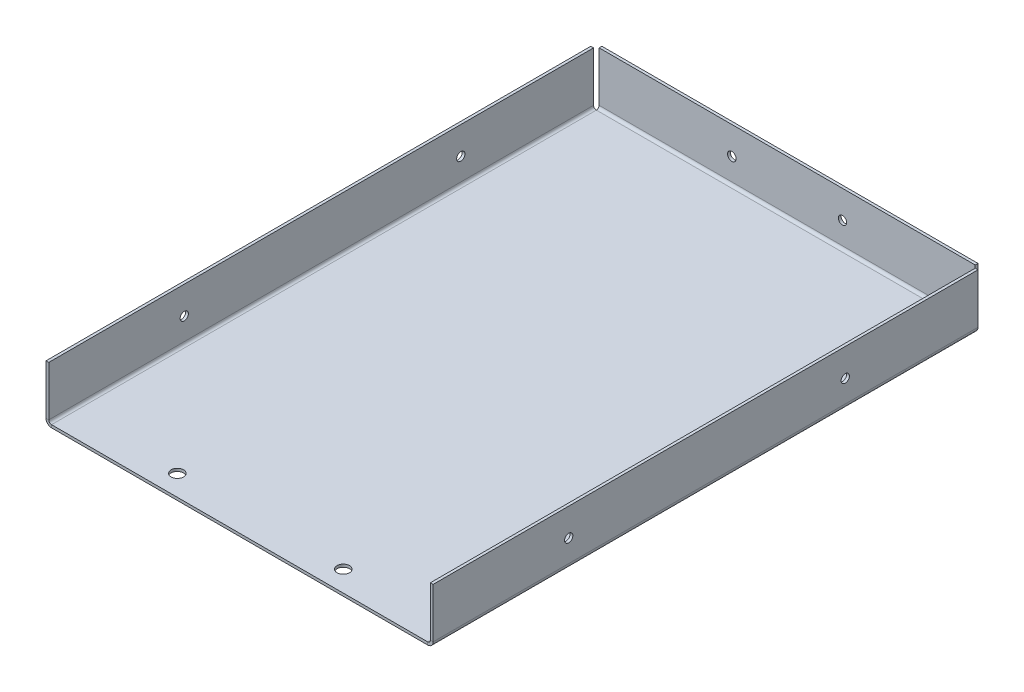
ISO-10303-21;
HEADER;
FILE_DESCRIPTION(('STEP AP214'),'2;1');
FILE_NAME('part.step','',(''),(''),'','','');
FILE_SCHEMA(('AUTOMOTIVE_DESIGN { 1 0 10303 214 1 1 1 1 }'));
ENDSEC;
DATA;
#1=APPLICATION_CONTEXT('core data for automotive mechanical design processes');
#2=APPLICATION_PROTOCOL_DEFINITION('international standard','automotive_design',2000,#1);
#3=PRODUCT_CONTEXT('',#1,'mechanical');
#4=PRODUCT('Part','Part','',(#3));
#5=PRODUCT_RELATED_PRODUCT_CATEGORY('part','',(#4));
#6=PRODUCT_DEFINITION_FORMATION('','',#4);
#7=PRODUCT_DEFINITION_CONTEXT('part definition',#1,'design');
#8=PRODUCT_DEFINITION('design','',#6,#7);
#9=PRODUCT_DEFINITION_SHAPE('','',#8);
#10=(LENGTH_UNIT() NAMED_UNIT(*) SI_UNIT(.MILLI.,.METRE.));
#11=(NAMED_UNIT(*) PLANE_ANGLE_UNIT() SI_UNIT($,.RADIAN.));
#12=(NAMED_UNIT(*) SI_UNIT($,.STERADIAN.) SOLID_ANGLE_UNIT());
#13=UNCERTAINTY_MEASURE_WITH_UNIT(LENGTH_MEASURE(1.E-05),#10,'distance_accuracy_value','');
#14=(GEOMETRIC_REPRESENTATION_CONTEXT(3) GLOBAL_UNCERTAINTY_ASSIGNED_CONTEXT((#13)) GLOBAL_UNIT_ASSIGNED_CONTEXT((#10,
#11,#12)) REPRESENTATION_CONTEXT('',''));
#15=CARTESIAN_POINT('',(0.,0.,0.));
#16=DIRECTION('',(0.,0.,1.));
#17=DIRECTION('',(1.,0.,0.));
#18=AXIS2_PLACEMENT_3D('',#15,#16,#17);
#19=CARTESIAN_POINT('',(0.,-1.,0.));
#20=DIRECTION('',(0.,-1.,0.));
#21=DIRECTION('',(0.,0.,-1.));
#22=AXIS2_PLACEMENT_3D('',#19,#20,#21);
#23=PLANE('',#22);
#24=CARTESIAN_POINT('',(38.0000000000019,-1.,-7.49999999999906));
#25=DIRECTION('',(0.,-1.,0.));
#26=DIRECTION('',(0.,0.,-1.));
#27=AXIS2_PLACEMENT_3D('',#24,#25,#26);
#28=CIRCLE('',#27,2.24999999999995);
#29=CARTESIAN_POINT('',(38.0000000000019,-1.,-9.74999999999902));
#30=VERTEX_POINT('',#29);
#31=EDGE_CURVE('E227',#30,#30,#28,.T.);
#32=ORIENTED_EDGE('',*,*,#31,.F.);
#33=EDGE_LOOP('',(#32));
#34=FACE_BOUND('',#33,.T.);
#35=CARTESIAN_POINT('',(98.0000000000019,-1.,-7.49999999999901));
#36=DIRECTION('',(0.,-1.,0.));
#37=DIRECTION('',(0.,0.,-1.));
#38=AXIS2_PLACEMENT_3D('',#35,#36,#37);
#39=CIRCLE('',#38,2.24999999999996);
#40=CARTESIAN_POINT('',(98.0000000000019,-1.,-9.74999999999896));
#41=VERTEX_POINT('',#40);
#42=EDGE_CURVE('E236',#41,#41,#39,.T.);
#43=ORIENTED_EDGE('',*,*,#42,.F.);
#44=EDGE_LOOP('',(#43));
#45=FACE_BOUND('',#44,.T.);
#46=DIRECTION('',(0.,0.,1.));
#47=VECTOR('',#46,1.);
#48=CARTESIAN_POINT('',(0.,-1.,0.));
#49=LINE('',#48,#47);
#50=CARTESIAN_POINT('',(0.,-1.00000000000001,-197.));
#51=VERTEX_POINT('',#50);
#52=CARTESIAN_POINT('',(0.,-1.,0.));
#53=VERTEX_POINT('',#52);
#54=EDGE_CURVE('E200',#51,#53,#49,.T.);
#55=ORIENTED_EDGE('',*,*,#54,.F.);
#56=DIRECTION('',(-1.,0.,0.));
#57=VECTOR('',#56,1.);
#58=CARTESIAN_POINT('',(0.,-1.00000000000001,-197.));
#59=LINE('',#58,#57);
#60=CARTESIAN_POINT('',(136.,-0.999999999999997,-197.));
#61=VERTEX_POINT('',#60);
#62=EDGE_CURVE('E114',#51,#61,#59,.F.);
#63=ORIENTED_EDGE('',*,*,#62,.T.);
#64=DIRECTION('',(0.,0.,-1.));
#65=VECTOR('',#64,1.);
#66=CARTESIAN_POINT('',(136.,-1.,0.));
#67=LINE('',#66,#65);
#68=CARTESIAN_POINT('',(136.,-1.,0.));
#69=VERTEX_POINT('',#68);
#70=EDGE_CURVE('E94',#69,#61,#67,.T.);
#71=ORIENTED_EDGE('',*,*,#70,.F.);
#72=DIRECTION('',(1.,0.,0.));
#73=VECTOR('',#72,1.);
#74=CARTESIAN_POINT('',(0.,-1.,0.));
#75=LINE('',#74,#73);
#76=EDGE_CURVE('E203',#53,#69,#75,.T.);
#77=ORIENTED_EDGE('',*,*,#76,.F.);
#78=EDGE_LOOP('',(#55,#63,#71,#77));
#79=FACE_BOUND('',#78,.T.);
#80=ADVANCED_FACE('F76',(#34,#45,#79),#23,.T.);
#81=CARTESIAN_POINT('',(0.,0.,0.));
#82=DIRECTION('',(0.,-1.,0.));
#83=DIRECTION('',(0.,0.,-1.));
#84=AXIS2_PLACEMENT_3D('',#81,#82,#83);
#85=PLANE('',#84);
#86=CARTESIAN_POINT('',(38.0000000000019,0.,-7.49999999999906));
#87=DIRECTION('',(0.,-1.,0.));
#88=DIRECTION('',(0.,0.,-1.));
#89=AXIS2_PLACEMENT_3D('',#86,#87,#88);
#90=CIRCLE('',#89,2.24999999999995);
#91=CARTESIAN_POINT('',(38.0000000000019,0.,-9.74999999999902));
#92=VERTEX_POINT('',#91);
#93=EDGE_CURVE('E218',#92,#92,#90,.T.);
#94=ORIENTED_EDGE('',*,*,#93,.T.);
#95=EDGE_LOOP('',(#94));
#96=FACE_BOUND('',#95,.T.);
#97=CARTESIAN_POINT('',(98.0000000000019,0.,-7.49999999999901));
#98=DIRECTION('',(0.,-1.,0.));
#99=DIRECTION('',(0.,0.,-1.));
#100=AXIS2_PLACEMENT_3D('',#97,#98,#99);
#101=CIRCLE('',#100,2.24999999999996);
#102=CARTESIAN_POINT('',(98.0000000000019,0.,-9.74999999999896));
#103=VERTEX_POINT('',#102);
#104=EDGE_CURVE('E224',#103,#103,#101,.T.);
#105=ORIENTED_EDGE('',*,*,#104,.T.);
#106=EDGE_LOOP('',(#105));
#107=FACE_BOUND('',#106,.T.);
#108=DIRECTION('',(-1.,0.,0.));
#109=VECTOR('',#108,1.);
#110=CARTESIAN_POINT('',(0.,0.,-197.));
#111=LINE('',#110,#109);
#112=CARTESIAN_POINT('',(0.,0.,-197.));
#113=VERTEX_POINT('',#112);
#114=CARTESIAN_POINT('',(136.,0.,-197.));
#115=VERTEX_POINT('',#114);
#116=EDGE_CURVE('E191',#113,#115,#111,.F.);
#117=ORIENTED_EDGE('',*,*,#116,.F.);
#118=DIRECTION('',(0.,0.,1.));
#119=VECTOR('',#118,1.);
#120=CARTESIAN_POINT('',(0.,0.,0.));
#121=LINE('',#120,#119);
#122=CARTESIAN_POINT('',(0.,0.,0.));
#123=VERTEX_POINT('',#122);
#124=EDGE_CURVE('E106',#113,#123,#121,.T.);
#125=ORIENTED_EDGE('',*,*,#124,.T.);
#126=DIRECTION('',(1.,0.,0.));
#127=VECTOR('',#126,1.);
#128=CARTESIAN_POINT('',(0.,0.,0.));
#129=LINE('',#128,#127);
#130=CARTESIAN_POINT('',(136.,0.,0.));
#131=VERTEX_POINT('',#130);
#132=EDGE_CURVE('E208',#123,#131,#129,.T.);
#133=ORIENTED_EDGE('',*,*,#132,.T.);
#134=DIRECTION('',(0.,0.,-1.));
#135=VECTOR('',#134,1.);
#136=CARTESIAN_POINT('',(136.,0.,0.));
#137=LINE('',#136,#135);
#138=EDGE_CURVE('E204',#131,#115,#137,.T.);
#139=ORIENTED_EDGE('',*,*,#138,.T.);
#140=EDGE_LOOP('',(#117,#125,#133,#139));
#141=FACE_BOUND('',#140,.T.);
#142=ADVANCED_FACE('F436',(#96,#107,#141),#85,.F.);
#143=CARTESIAN_POINT('',(0.,-1.,0.));
#144=DIRECTION('',(0.,0.,1.));
#145=DIRECTION('',(1.,0.,0.));
#146=AXIS2_PLACEMENT_3D('',#143,#144,#145);
#147=PLANE('',#146);
#148=ORIENTED_EDGE('',*,*,#132,.F.);
#149=DIRECTION('',(0.,1.,0.));
#150=VECTOR('',#149,1.);
#151=CARTESIAN_POINT('',(0.,-1.,0.));
#152=LINE('',#151,#150);
#153=EDGE_CURVE('E86',#53,#123,#152,.T.);
#154=ORIENTED_EDGE('',*,*,#153,.F.);
#155=ORIENTED_EDGE('',*,*,#76,.T.);
#156=DIRECTION('',(0.,1.,0.));
#157=VECTOR('',#156,1.);
#158=CARTESIAN_POINT('',(136.,-1.,0.));
#159=LINE('',#158,#157);
#160=EDGE_CURVE('E13',#69,#131,#159,.T.);
#161=ORIENTED_EDGE('',*,*,#160,.T.);
#162=EDGE_LOOP('',(#148,#154,#155,#161));
#163=FACE_BOUND('',#162,.T.);
#164=ADVANCED_FACE('F78',(#163),#147,.T.);
#165=CARTESIAN_POINT('',(136.,0.999999999999994,-197.));
#166=DIRECTION('',(1.,0.,0.));
#167=DIRECTION('',(0.,0.,-1.));
#168=AXIS2_PLACEMENT_3D('',#165,#166,#167);
#169=PLANE('',#168);
#170=DIRECTION('',(0.,0.,-1.));
#171=VECTOR('',#170,1.);
#172=CARTESIAN_POINT('',(136.,1.,-198.));
#173=LINE('',#172,#171);
#174=CARTESIAN_POINT('',(136.,0.999999999999991,-198.));
#175=VERTEX_POINT('',#174);
#176=CARTESIAN_POINT('',(136.,0.999999999999988,-199.));
#177=VERTEX_POINT('',#176);
#178=EDGE_CURVE('E132',#175,#177,#173,.T.);
#179=ORIENTED_EDGE('',*,*,#178,.F.);
#180=CARTESIAN_POINT('',(136.,0.999999999999994,-197.));
#181=DIRECTION('',(-1.,0.,0.));
#182=DIRECTION('',(0.,0.,1.));
#183=AXIS2_PLACEMENT_3D('',#180,#181,#182);
#184=CIRCLE('',#183,1.);
#185=EDGE_CURVE('E189',#115,#175,#184,.F.);
#186=ORIENTED_EDGE('',*,*,#185,.F.);
#187=DIRECTION('',(0.,-1.,0.));
#188=VECTOR('',#187,1.);
#189=CARTESIAN_POINT('',(136.,0.,-197.));
#190=LINE('',#189,#188);
#191=EDGE_CURVE('E195',#115,#61,#190,.T.);
#192=ORIENTED_EDGE('',*,*,#191,.T.);
#193=CARTESIAN_POINT('',(136.,0.999999999999994,-197.));
#194=DIRECTION('',(-1.,0.,0.));
#195=DIRECTION('',(0.,0.,1.));
#196=AXIS2_PLACEMENT_3D('',#193,#194,#195);
#197=CIRCLE('',#196,2.);
#198=EDGE_CURVE('E184',#61,#177,#197,.F.);
#199=ORIENTED_EDGE('',*,*,#198,.T.);
#200=EDGE_LOOP('',(#179,#186,#192,#199));
#201=FACE_BOUND('',#200,.T.);
#202=ADVANCED_FACE('F379',(#201),#169,.T.);
#203=CARTESIAN_POINT('',(0.,0.999999999999994,-197.));
#204=DIRECTION('',(1.,0.,0.));
#205=DIRECTION('',(0.,0.,-1.));
#206=AXIS2_PLACEMENT_3D('',#203,#204,#205);
#207=PLANE('',#206);
#208=CARTESIAN_POINT('',(0.,0.999999999999994,-197.));
#209=DIRECTION('',(-1.,0.,0.));
#210=DIRECTION('',(0.,0.,1.));
#211=AXIS2_PLACEMENT_3D('',#208,#209,#210);
#212=CIRCLE('',#211,1.);
#213=CARTESIAN_POINT('',(0.,0.999999999999991,-198.));
#214=VERTEX_POINT('',#213);
#215=EDGE_CURVE('E182',#214,#113,#212,.T.);
#216=ORIENTED_EDGE('',*,*,#215,.F.);
#217=DIRECTION('',(0.,0.,-1.));
#218=VECTOR('',#217,1.);
#219=CARTESIAN_POINT('',(0.,1.,-198.));
#220=LINE('',#219,#218);
#221=CARTESIAN_POINT('',(0.,1.00000000000001,-199.));
#222=VERTEX_POINT('',#221);
#223=EDGE_CURVE('E360',#214,#222,#220,.T.);
#224=ORIENTED_EDGE('',*,*,#223,.T.);
#225=CARTESIAN_POINT('',(0.,0.999999999999994,-197.));
#226=DIRECTION('',(-1.,0.,0.));
#227=DIRECTION('',(0.,0.,1.));
#228=AXIS2_PLACEMENT_3D('',#225,#226,#227);
#229=CIRCLE('',#228,2.);
#230=EDGE_CURVE('E185',#222,#51,#229,.T.);
#231=ORIENTED_EDGE('',*,*,#230,.T.);
#232=DIRECTION('',(0.,-1.,0.));
#233=VECTOR('',#232,1.);
#234=CARTESIAN_POINT('',(0.,0.,-197.));
#235=LINE('',#234,#233);
#236=EDGE_CURVE('E187',#113,#51,#235,.T.);
#237=ORIENTED_EDGE('',*,*,#236,.F.);
#238=EDGE_LOOP('',(#216,#224,#231,#237));
#239=FACE_BOUND('',#238,.T.);
#240=ADVANCED_FACE('F374',(#239),#207,.F.);
#241=CARTESIAN_POINT('',(0.,0.999999999999994,-197.));
#242=DIRECTION('',(-1.,0.,0.));
#243=DIRECTION('',(0.,0.,-1.));
#244=AXIS2_PLACEMENT_3D('',#241,#242,#243);
#245=CYLINDRICAL_SURFACE('',#244,2.);
#246=ORIENTED_EDGE('',*,*,#62,.F.);
#247=ORIENTED_EDGE('',*,*,#230,.F.);
#248=DIRECTION('',(1.,0.,0.));
#249=VECTOR('',#248,1.);
#250=CARTESIAN_POINT('',(0.,1.00000000000001,-199.));
#251=LINE('',#250,#249);
#252=EDGE_CURVE('E363',#222,#177,#251,.T.);
#253=ORIENTED_EDGE('',*,*,#252,.T.);
#254=ORIENTED_EDGE('',*,*,#198,.F.);
#255=EDGE_LOOP('',(#246,#247,#253,#254));
#256=FACE_BOUND('',#255,.T.);
#257=ADVANCED_FACE('F378',(#256),#245,.T.);
#258=CARTESIAN_POINT('',(0.,0.999999999999994,-197.));
#259=DIRECTION('',(-1.,0.,0.));
#260=DIRECTION('',(0.,0.,-1.));
#261=AXIS2_PLACEMENT_3D('',#258,#259,#260);
#262=CYLINDRICAL_SURFACE('',#261,1.);
#263=ORIENTED_EDGE('',*,*,#116,.T.);
#264=ORIENTED_EDGE('',*,*,#185,.T.);
#265=DIRECTION('',(-1.,0.,0.));
#266=VECTOR('',#265,1.);
#267=CARTESIAN_POINT('',(136.,1.,-198.));
#268=LINE('',#267,#266);
#269=EDGE_CURVE('E175',#175,#214,#268,.T.);
#270=ORIENTED_EDGE('',*,*,#269,.T.);
#271=ORIENTED_EDGE('',*,*,#215,.T.);
#272=EDGE_LOOP('',(#263,#264,#270,#271));
#273=FACE_BOUND('',#272,.T.);
#274=ADVANCED_FACE('F508',(#273),#262,.F.);
#275=CARTESIAN_POINT('',(0.,19.,-199.));
#276=DIRECTION('',(1.,0.,0.));
#277=DIRECTION('',(0.,0.,-1.));
#278=AXIS2_PLACEMENT_3D('',#275,#276,#277);
#279=PLANE('',#278);
#280=ORIENTED_EDGE('',*,*,#223,.F.);
#281=DIRECTION('',(0.,1.,0.));
#282=VECTOR('',#281,1.);
#283=CARTESIAN_POINT('',(0.,19.,-198.));
#284=LINE('',#283,#282);
#285=CARTESIAN_POINT('',(0.,19.,-198.));
#286=VERTEX_POINT('',#285);
#287=EDGE_CURVE('E166',#214,#286,#284,.T.);
#288=ORIENTED_EDGE('',*,*,#287,.T.);
#289=DIRECTION('',(0.,0.,1.));
#290=VECTOR('',#289,1.);
#291=CARTESIAN_POINT('',(0.,19.,-199.));
#292=LINE('',#291,#290);
#293=CARTESIAN_POINT('',(0.,19.,-199.));
#294=VERTEX_POINT('',#293);
#295=EDGE_CURVE('E161',#294,#286,#292,.T.);
#296=ORIENTED_EDGE('',*,*,#295,.F.);
#297=DIRECTION('',(0.,1.,0.));
#298=VECTOR('',#297,1.);
#299=CARTESIAN_POINT('',(0.,19.,-199.));
#300=LINE('',#299,#298);
#301=EDGE_CURVE('E176',#222,#294,#300,.T.);
#302=ORIENTED_EDGE('',*,*,#301,.F.);
#303=EDGE_LOOP('',(#280,#288,#296,#302));
#304=FACE_BOUND('',#303,.T.);
#305=ADVANCED_FACE('F369',(#304),#279,.F.);
#306=CARTESIAN_POINT('',(136.,0.,-199.));
#307=DIRECTION('',(-1.,0.,0.));
#308=DIRECTION('',(0.,0.,1.));
#309=AXIS2_PLACEMENT_3D('',#306,#307,#308);
#310=PLANE('',#309);
#311=ORIENTED_EDGE('',*,*,#178,.T.);
#312=DIRECTION('',(0.,-1.,0.));
#313=VECTOR('',#312,1.);
#314=CARTESIAN_POINT('',(136.,0.,-199.));
#315=LINE('',#314,#313);
#316=CARTESIAN_POINT('',(136.,19.,-199.));
#317=VERTEX_POINT('',#316);
#318=EDGE_CURVE('E171',#317,#177,#315,.T.);
#319=ORIENTED_EDGE('',*,*,#318,.F.);
#320=DIRECTION('',(0.,0.,1.));
#321=VECTOR('',#320,1.);
#322=CARTESIAN_POINT('',(136.,19.,-199.));
#323=LINE('',#322,#321);
#324=CARTESIAN_POINT('',(136.,19.,-198.));
#325=VERTEX_POINT('',#324);
#326=EDGE_CURVE('E158',#317,#325,#323,.T.);
#327=ORIENTED_EDGE('',*,*,#326,.T.);
#328=DIRECTION('',(0.,-1.,0.));
#329=VECTOR('',#328,1.);
#330=CARTESIAN_POINT('',(136.,0.,-198.));
#331=LINE('',#330,#329);
#332=EDGE_CURVE('E165',#325,#175,#331,.T.);
#333=ORIENTED_EDGE('',*,*,#332,.T.);
#334=EDGE_LOOP('',(#311,#319,#327,#333));
#335=FACE_BOUND('',#334,.T.);
#336=ADVANCED_FACE('F170',(#335),#310,.F.);
#337=CARTESIAN_POINT('',(0.,-5.8197610995932E-13,-199.));
#338=DIRECTION('',(0.,0.,1.));
#339=DIRECTION('',(0.,-1.,0.));
#340=AXIS2_PLACEMENT_3D('',#337,#338,#339);
#341=PLANE('',#340);
#342=CARTESIAN_POINT('',(48.0000000000012,9.00000000000001,-199.));
#343=DIRECTION('',(0.,0.,1.));
#344=DIRECTION('',(0.,-1.,0.));
#345=AXIS2_PLACEMENT_3D('',#342,#343,#344);
#346=CIRCLE('',#345,1.54999999999999);
#347=CARTESIAN_POINT('',(48.0000000000012,7.45000000000002,-199.));
#348=VERTEX_POINT('',#347);
#349=EDGE_CURVE('E232',#348,#348,#346,.T.);
#350=ORIENTED_EDGE('',*,*,#349,.T.);
#351=EDGE_LOOP('',(#350));
#352=FACE_BOUND('',#351,.T.);
#353=CARTESIAN_POINT('',(88.0000000000013,9.00000000000023,-199.));
#354=DIRECTION('',(0.,0.,1.));
#355=DIRECTION('',(0.,-1.,0.));
#356=AXIS2_PLACEMENT_3D('',#353,#354,#355);
#357=CIRCLE('',#356,1.5);
#358=CARTESIAN_POINT('',(88.0000000000013,7.50000000000024,-199.));
#359=VERTEX_POINT('',#358);
#360=EDGE_CURVE('E231',#359,#359,#357,.T.);
#361=ORIENTED_EDGE('',*,*,#360,.T.);
#362=EDGE_LOOP('',(#361));
#363=FACE_BOUND('',#362,.T.);
#364=ORIENTED_EDGE('',*,*,#252,.F.);
#365=ORIENTED_EDGE('',*,*,#301,.T.);
#366=DIRECTION('',(1.,0.,0.));
#367=VECTOR('',#366,1.);
#368=CARTESIAN_POINT('',(136.,19.,-199.));
#369=LINE('',#368,#367);
#370=EDGE_CURVE('E142',#294,#317,#369,.T.);
#371=ORIENTED_EDGE('',*,*,#370,.T.);
#372=ORIENTED_EDGE('',*,*,#318,.T.);
#373=EDGE_LOOP('',(#364,#365,#371,#372));
#374=FACE_BOUND('',#373,.T.);
#375=ADVANCED_FACE('F377',(#352,#363,#374),#341,.F.);
#376=CARTESIAN_POINT('',(0.,-5.78484628620477E-13,-198.));
#377=DIRECTION('',(0.,0.,1.));
#378=DIRECTION('',(0.,-1.,0.));
#379=AXIS2_PLACEMENT_3D('',#376,#377,#378);
#380=PLANE('',#379);
#381=CARTESIAN_POINT('',(48.0000000000012,9.00000000000001,-198.));
#382=DIRECTION('',(0.,0.,1.));
#383=DIRECTION('',(0.,-1.,0.));
#384=AXIS2_PLACEMENT_3D('',#381,#382,#383);
#385=CIRCLE('',#384,1.54999999999999);
#386=CARTESIAN_POINT('',(48.0000000000012,7.45000000000002,-198.));
#387=VERTEX_POINT('',#386);
#388=EDGE_CURVE('E80',#387,#387,#385,.T.);
#389=ORIENTED_EDGE('',*,*,#388,.F.);
#390=EDGE_LOOP('',(#389));
#391=FACE_BOUND('',#390,.T.);
#392=CARTESIAN_POINT('',(88.0000000000013,9.00000000000024,-198.));
#393=DIRECTION('',(0.,0.,1.));
#394=DIRECTION('',(0.,-1.,0.));
#395=AXIS2_PLACEMENT_3D('',#392,#393,#394);
#396=CIRCLE('',#395,1.5);
#397=CARTESIAN_POINT('',(88.0000000000013,7.50000000000024,-198.));
#398=VERTEX_POINT('',#397);
#399=EDGE_CURVE('E229',#398,#398,#396,.T.);
#400=ORIENTED_EDGE('',*,*,#399,.F.);
#401=EDGE_LOOP('',(#400));
#402=FACE_BOUND('',#401,.T.);
#403=ORIENTED_EDGE('',*,*,#287,.F.);
#404=ORIENTED_EDGE('',*,*,#269,.F.);
#405=ORIENTED_EDGE('',*,*,#332,.F.);
#406=DIRECTION('',(1.,0.,0.));
#407=VECTOR('',#406,1.);
#408=CARTESIAN_POINT('',(136.,19.,-198.));
#409=LINE('',#408,#407);
#410=EDGE_CURVE('E155',#286,#325,#409,.T.);
#411=ORIENTED_EDGE('',*,*,#410,.F.);
#412=EDGE_LOOP('',(#403,#404,#405,#411));
#413=FACE_BOUND('',#412,.T.);
#414=ADVANCED_FACE('F174',(#391,#402,#413),#380,.T.);
#415=CARTESIAN_POINT('',(136.,19.,-199.));
#416=DIRECTION('',(0.,-1.,0.));
#417=DIRECTION('',(0.,0.,-1.));
#418=AXIS2_PLACEMENT_3D('',#415,#416,#417);
#419=PLANE('',#418);
#420=ORIENTED_EDGE('',*,*,#410,.T.);
#421=ORIENTED_EDGE('',*,*,#326,.F.);
#422=ORIENTED_EDGE('',*,*,#370,.F.);
#423=ORIENTED_EDGE('',*,*,#295,.T.);
#424=EDGE_LOOP('',(#420,#421,#422,#423));
#425=FACE_BOUND('',#424,.T.);
#426=ADVANCED_FACE('F157',(#425),#419,.F.);
#427=CARTESIAN_POINT('',(136.,1.,0.));
#428=DIRECTION('',(0.,0.,1.));
#429=DIRECTION('',(1.,0.,0.));
#430=AXIS2_PLACEMENT_3D('',#427,#428,#429);
#431=PLANE('',#430);
#432=DIRECTION('',(-1.,0.,0.));
#433=VECTOR('',#432,1.);
#434=CARTESIAN_POINT('',(138.,0.999999999999998,0.));
#435=LINE('',#434,#433);
#436=CARTESIAN_POINT('',(137.,1.,0.));
#437=VERTEX_POINT('',#436);
#438=CARTESIAN_POINT('',(138.,0.999999999999998,0.));
#439=VERTEX_POINT('',#438);
#440=EDGE_CURVE('E303',#437,#439,#435,.F.);
#441=ORIENTED_EDGE('',*,*,#440,.F.);
#442=CARTESIAN_POINT('',(136.,1.,0.));
#443=DIRECTION('',(0.,0.,-1.));
#444=DIRECTION('',(-1.,0.,0.));
#445=AXIS2_PLACEMENT_3D('',#442,#443,#444);
#446=CIRCLE('',#445,1.);
#447=EDGE_CURVE('E354',#131,#437,#446,.F.);
#448=ORIENTED_EDGE('',*,*,#447,.F.);
#449=ORIENTED_EDGE('',*,*,#160,.F.);
#450=CARTESIAN_POINT('',(136.,1.,0.));
#451=DIRECTION('',(0.,0.,-1.));
#452=DIRECTION('',(-1.,0.,0.));
#453=AXIS2_PLACEMENT_3D('',#450,#451,#452);
#454=CIRCLE('',#453,2.);
#455=EDGE_CURVE('E348',#69,#439,#454,.F.);
#456=ORIENTED_EDGE('',*,*,#455,.T.);
#457=EDGE_LOOP('',(#441,#448,#449,#456));
#458=FACE_BOUND('',#457,.T.);
#459=ADVANCED_FACE('F433',(#458),#431,.T.);
#460=CARTESIAN_POINT('',(136.,1.,-197.));
#461=DIRECTION('',(0.,0.,1.));
#462=DIRECTION('',(1.,0.,0.));
#463=AXIS2_PLACEMENT_3D('',#460,#461,#462);
#464=PLANE('',#463);
#465=CARTESIAN_POINT('',(136.,1.,-197.));
#466=DIRECTION('',(0.,0.,-1.));
#467=DIRECTION('',(-1.,0.,0.));
#468=AXIS2_PLACEMENT_3D('',#465,#466,#467);
#469=CIRCLE('',#468,1.);
#470=CARTESIAN_POINT('',(137.,1.,-197.));
#471=VERTEX_POINT('',#470);
#472=EDGE_CURVE('E315',#471,#115,#469,.T.);
#473=ORIENTED_EDGE('',*,*,#472,.F.);
#474=DIRECTION('',(-1.,0.,0.));
#475=VECTOR('',#474,1.);
#476=CARTESIAN_POINT('',(137.,1.,-197.));
#477=LINE('',#476,#475);
#478=CARTESIAN_POINT('',(138.,0.999999999999998,-197.));
#479=VERTEX_POINT('',#478);
#480=EDGE_CURVE('E340',#471,#479,#477,.F.);
#481=ORIENTED_EDGE('',*,*,#480,.T.);
#482=CARTESIAN_POINT('',(136.,1.,-197.));
#483=DIRECTION('',(0.,0.,-1.));
#484=DIRECTION('',(-1.,0.,0.));
#485=AXIS2_PLACEMENT_3D('',#482,#483,#484);
#486=CIRCLE('',#485,2.);
#487=EDGE_CURVE('E351',#479,#61,#486,.T.);
#488=ORIENTED_EDGE('',*,*,#487,.T.);
#489=ORIENTED_EDGE('',*,*,#191,.F.);
#490=EDGE_LOOP('',(#473,#481,#488,#489));
#491=FACE_BOUND('',#490,.T.);
#492=ADVANCED_FACE('F385',(#491),#464,.F.);
#493=CARTESIAN_POINT('',(136.,1.,-197.));
#494=DIRECTION('',(0.,0.,-1.));
#495=DIRECTION('',(1.,0.,0.));
#496=AXIS2_PLACEMENT_3D('',#493,#494,#495);
#497=CYLINDRICAL_SURFACE('',#496,2.);
#498=ORIENTED_EDGE('',*,*,#70,.T.);
#499=ORIENTED_EDGE('',*,*,#487,.F.);
#500=DIRECTION('',(0.,0.,-1.));
#501=VECTOR('',#500,1.);
#502=CARTESIAN_POINT('',(138.,0.999999999999998,0.));
#503=LINE('',#502,#501);
#504=EDGE_CURVE('E337',#479,#439,#503,.F.);
#505=ORIENTED_EDGE('',*,*,#504,.T.);
#506=ORIENTED_EDGE('',*,*,#455,.F.);
#507=EDGE_LOOP('',(#498,#499,#505,#506));
#508=FACE_BOUND('',#507,.T.);
#509=ADVANCED_FACE('F429',(#508),#497,.T.);
#510=CARTESIAN_POINT('',(136.,1.,-197.));
#511=DIRECTION('',(0.,0.,-1.));
#512=DIRECTION('',(1.,0.,0.));
#513=AXIS2_PLACEMENT_3D('',#510,#511,#512);
#514=CYLINDRICAL_SURFACE('',#513,1.);
#515=ORIENTED_EDGE('',*,*,#138,.F.);
#516=ORIENTED_EDGE('',*,*,#447,.T.);
#517=DIRECTION('',(0.,0.,-1.));
#518=VECTOR('',#517,1.);
#519=CARTESIAN_POINT('',(137.,1.,0.));
#520=LINE('',#519,#518);
#521=EDGE_CURVE('E343',#437,#471,#520,.T.);
#522=ORIENTED_EDGE('',*,*,#521,.T.);
#523=ORIENTED_EDGE('',*,*,#472,.T.);
#524=EDGE_LOOP('',(#515,#516,#522,#523));
#525=FACE_BOUND('',#524,.T.);
#526=ADVANCED_FACE('F391',(#525),#514,.F.);
#527=CARTESIAN_POINT('',(138.,0.,0.));
#528=DIRECTION('',(0.,0.,-1.));
#529=DIRECTION('',(0.,1.,0.));
#530=AXIS2_PLACEMENT_3D('',#527,#528,#529);
#531=PLANE('',#530);
#532=ORIENTED_EDGE('',*,*,#440,.T.);
#533=DIRECTION('',(0.,-1.,0.));
#534=VECTOR('',#533,1.);
#535=CARTESIAN_POINT('',(138.,-4.00834458573109E-13,0.));
#536=LINE('',#535,#534);
#537=CARTESIAN_POINT('',(138.,19.,0.));
#538=VERTEX_POINT('',#537);
#539=EDGE_CURVE('E325',#538,#439,#536,.T.);
#540=ORIENTED_EDGE('',*,*,#539,.F.);
#541=DIRECTION('',(-1.,0.,0.));
#542=VECTOR('',#541,1.);
#543=CARTESIAN_POINT('',(138.,19.,0.));
#544=LINE('',#543,#542);
#545=CARTESIAN_POINT('',(137.,19.,0.));
#546=VERTEX_POINT('',#545);
#547=EDGE_CURVE('E316',#538,#546,#544,.T.);
#548=ORIENTED_EDGE('',*,*,#547,.T.);
#549=DIRECTION('',(0.,1.,0.));
#550=VECTOR('',#549,1.);
#551=CARTESIAN_POINT('',(137.,0.,0.));
#552=LINE('',#551,#550);
#553=EDGE_CURVE('E334',#546,#437,#552,.F.);
#554=ORIENTED_EDGE('',*,*,#553,.T.);
#555=EDGE_LOOP('',(#532,#540,#548,#554));
#556=FACE_BOUND('',#555,.T.);
#557=ADVANCED_FACE('F406',(#556),#531,.F.);
#558=CARTESIAN_POINT('',(138.,19.,-197.));
#559=DIRECTION('',(0.,0.,1.));
#560=DIRECTION('',(1.,0.,0.));
#561=AXIS2_PLACEMENT_3D('',#558,#559,#560);
#562=PLANE('',#561);
#563=ORIENTED_EDGE('',*,*,#480,.F.);
#564=DIRECTION('',(0.,-1.,0.));
#565=VECTOR('',#564,1.);
#566=CARTESIAN_POINT('',(137.,19.,-197.));
#567=LINE('',#566,#565);
#568=CARTESIAN_POINT('',(137.,19.,-197.));
#569=VERTEX_POINT('',#568);
#570=EDGE_CURVE('E331',#471,#569,#567,.F.);
#571=ORIENTED_EDGE('',*,*,#570,.T.);
#572=DIRECTION('',(-1.,0.,0.));
#573=VECTOR('',#572,1.);
#574=CARTESIAN_POINT('',(138.,19.,-197.));
#575=LINE('',#574,#573);
#576=CARTESIAN_POINT('',(138.,19.,-197.));
#577=VERTEX_POINT('',#576);
#578=EDGE_CURVE('E312',#577,#569,#575,.T.);
#579=ORIENTED_EDGE('',*,*,#578,.F.);
#580=DIRECTION('',(0.,1.,0.));
#581=VECTOR('',#580,1.);
#582=CARTESIAN_POINT('',(138.,-4.00834458573109E-13,-197.));
#583=LINE('',#582,#581);
#584=EDGE_CURVE('E322',#479,#577,#583,.T.);
#585=ORIENTED_EDGE('',*,*,#584,.F.);
#586=EDGE_LOOP('',(#563,#571,#579,#585));
#587=FACE_BOUND('',#586,.T.);
#588=ADVANCED_FACE('F534',(#587),#562,.F.);
#589=CARTESIAN_POINT('',(138.,-4.00834458573109E-13,0.));
#590=DIRECTION('',(-1.,0.,0.));
#591=DIRECTION('',(0.,-1.,0.));
#592=AXIS2_PLACEMENT_3D('',#589,#590,#591);
#593=PLANE('',#592);
#594=CARTESIAN_POINT('',(138.,9.00000000000156,-148.999999999998));
#595=DIRECTION('',(-1.,0.,0.));
#596=DIRECTION('',(0.,-1.,0.));
#597=AXIS2_PLACEMENT_3D('',#594,#595,#596);
#598=CIRCLE('',#597,1.5);
#599=CARTESIAN_POINT('',(138.,7.50000000000156,-148.999999999998));
#600=VERTEX_POINT('',#599);
#601=EDGE_CURVE('E260',#600,#600,#598,.T.);
#602=ORIENTED_EDGE('',*,*,#601,.T.);
#603=EDGE_LOOP('',(#602));
#604=FACE_BOUND('',#603,.T.);
#605=CARTESIAN_POINT('',(138.,9.00000000000156,-48.9999999999985));
#606=DIRECTION('',(-1.,0.,0.));
#607=DIRECTION('',(0.,-1.,0.));
#608=AXIS2_PLACEMENT_3D('',#605,#606,#607);
#609=CIRCLE('',#608,1.50000000000002);
#610=CARTESIAN_POINT('',(138.,7.50000000000153,-48.9999999999985));
#611=VERTEX_POINT('',#610);
#612=EDGE_CURVE('E223',#611,#611,#609,.T.);
#613=ORIENTED_EDGE('',*,*,#612,.T.);
#614=EDGE_LOOP('',(#613));
#615=FACE_BOUND('',#614,.T.);
#616=ORIENTED_EDGE('',*,*,#504,.F.);
#617=ORIENTED_EDGE('',*,*,#584,.T.);
#618=DIRECTION('',(0.,0.,1.));
#619=VECTOR('',#618,1.);
#620=CARTESIAN_POINT('',(138.,19.,0.));
#621=LINE('',#620,#619);
#622=EDGE_CURVE('E319',#577,#538,#621,.T.);
#623=ORIENTED_EDGE('',*,*,#622,.T.);
#624=ORIENTED_EDGE('',*,*,#539,.T.);
#625=EDGE_LOOP('',(#616,#617,#623,#624));
#626=FACE_BOUND('',#625,.T.);
#627=ADVANCED_FACE('F537',(#604,#615,#626),#593,.F.);
#628=CARTESIAN_POINT('',(137.,-3.97342977234266E-13,0.));
#629=DIRECTION('',(-1.,0.,0.));
#630=DIRECTION('',(0.,-1.,0.));
#631=AXIS2_PLACEMENT_3D('',#628,#629,#630);
#632=PLANE('',#631);
#633=CARTESIAN_POINT('',(137.,9.00000000000155,-148.999999999998));
#634=DIRECTION('',(-1.,0.,0.));
#635=DIRECTION('',(0.,-1.,0.));
#636=AXIS2_PLACEMENT_3D('',#633,#634,#635);
#637=CIRCLE('',#636,1.5);
#638=CARTESIAN_POINT('',(137.,7.50000000000156,-148.999999999998));
#639=VERTEX_POINT('',#638);
#640=EDGE_CURVE('E257',#639,#639,#637,.T.);
#641=ORIENTED_EDGE('',*,*,#640,.F.);
#642=EDGE_LOOP('',(#641));
#643=FACE_BOUND('',#642,.T.);
#644=CARTESIAN_POINT('',(137.,9.00000000000155,-48.9999999999985));
#645=DIRECTION('',(-1.,0.,0.));
#646=DIRECTION('',(0.,-1.,0.));
#647=AXIS2_PLACEMENT_3D('',#644,#645,#646);
#648=CIRCLE('',#647,1.50000000000002);
#649=CARTESIAN_POINT('',(137.,7.50000000000153,-48.9999999999985));
#650=VERTEX_POINT('',#649);
#651=EDGE_CURVE('E250',#650,#650,#648,.T.);
#652=ORIENTED_EDGE('',*,*,#651,.F.);
#653=EDGE_LOOP('',(#652));
#654=FACE_BOUND('',#653,.T.);
#655=ORIENTED_EDGE('',*,*,#570,.F.);
#656=ORIENTED_EDGE('',*,*,#521,.F.);
#657=ORIENTED_EDGE('',*,*,#553,.F.);
#658=DIRECTION('',(0.,0.,-1.));
#659=VECTOR('',#658,1.);
#660=CARTESIAN_POINT('',(137.,19.,0.));
#661=LINE('',#660,#659);
#662=EDGE_CURVE('E328',#569,#546,#661,.F.);
#663=ORIENTED_EDGE('',*,*,#662,.F.);
#664=EDGE_LOOP('',(#655,#656,#657,#663));
#665=FACE_BOUND('',#664,.T.);
#666=ADVANCED_FACE('F399',(#643,#654,#665),#632,.T.);
#667=CARTESIAN_POINT('',(138.,19.,0.));
#668=DIRECTION('',(0.,-1.,0.));
#669=DIRECTION('',(1.,0.,0.));
#670=AXIS2_PLACEMENT_3D('',#667,#668,#669);
#671=PLANE('',#670);
#672=ORIENTED_EDGE('',*,*,#662,.T.);
#673=ORIENTED_EDGE('',*,*,#547,.F.);
#674=ORIENTED_EDGE('',*,*,#622,.F.);
#675=ORIENTED_EDGE('',*,*,#578,.T.);
#676=EDGE_LOOP('',(#672,#673,#674,#675));
#677=FACE_BOUND('',#676,.T.);
#678=ADVANCED_FACE('F414',(#677),#671,.F.);
#679=CARTESIAN_POINT('',(0.,0.999999999999997,-197.));
#680=DIRECTION('',(0.,0.,-1.));
#681=DIRECTION('',(-1.,0.,0.));
#682=AXIS2_PLACEMENT_3D('',#679,#680,#681);
#683=PLANE('',#682);
#684=DIRECTION('',(1.,0.,0.));
#685=VECTOR('',#684,1.);
#686=CARTESIAN_POINT('',(-2.,0.999999999999986,-197.));
#687=LINE('',#686,#685);
#688=CARTESIAN_POINT('',(-1.,0.999999999999993,-197.));
#689=VERTEX_POINT('',#688);
#690=CARTESIAN_POINT('',(-2.,0.99999999999999,-197.));
#691=VERTEX_POINT('',#690);
#692=EDGE_CURVE('E263',#689,#691,#687,.F.);
#693=ORIENTED_EDGE('',*,*,#692,.F.);
#694=CARTESIAN_POINT('',(0.,0.999999999999997,-197.));
#695=DIRECTION('',(0.,0.,1.));
#696=DIRECTION('',(1.,0.,0.));
#697=AXIS2_PLACEMENT_3D('',#694,#695,#696);
#698=CIRCLE('',#697,1.);
#699=EDGE_CURVE('E307',#113,#689,#698,.F.);
#700=ORIENTED_EDGE('',*,*,#699,.F.);
#701=ORIENTED_EDGE('',*,*,#236,.T.);
#702=CARTESIAN_POINT('',(0.,0.999999999999997,-197.));
#703=DIRECTION('',(0.,0.,1.));
#704=DIRECTION('',(1.,0.,0.));
#705=AXIS2_PLACEMENT_3D('',#702,#703,#704);
#706=CIRCLE('',#705,2.);
#707=EDGE_CURVE('E300',#51,#691,#706,.F.);
#708=ORIENTED_EDGE('',*,*,#707,.T.);
#709=EDGE_LOOP('',(#693,#700,#701,#708));
#710=FACE_BOUND('',#709,.T.);
#711=ADVANCED_FACE('F446',(#710),#683,.T.);
#712=CARTESIAN_POINT('',(0.,0.999999999999997,0.));
#713=DIRECTION('',(0.,0.,-1.));
#714=DIRECTION('',(-1.,0.,0.));
#715=AXIS2_PLACEMENT_3D('',#712,#713,#714);
#716=PLANE('',#715);
#717=CARTESIAN_POINT('',(0.,0.999999999999997,0.));
#718=DIRECTION('',(0.,0.,1.));
#719=DIRECTION('',(1.,0.,0.));
#720=AXIS2_PLACEMENT_3D('',#717,#718,#719);
#721=CIRCLE('',#720,1.);
#722=CARTESIAN_POINT('',(-1.,0.999999999999993,0.));
#723=VERTEX_POINT('',#722);
#724=EDGE_CURVE('E267',#723,#123,#721,.T.);
#725=ORIENTED_EDGE('',*,*,#724,.F.);
#726=DIRECTION('',(1.,0.,0.));
#727=VECTOR('',#726,1.);
#728=CARTESIAN_POINT('',(-1.,0.999999999999997,0.));
#729=LINE('',#728,#727);
#730=CARTESIAN_POINT('',(-2.,0.999999999999993,0.));
#731=VERTEX_POINT('',#730);
#732=EDGE_CURVE('E292',#723,#731,#729,.F.);
#733=ORIENTED_EDGE('',*,*,#732,.T.);
#734=CARTESIAN_POINT('',(0.,0.999999999999997,0.));
#735=DIRECTION('',(0.,0.,1.));
#736=DIRECTION('',(1.,0.,0.));
#737=AXIS2_PLACEMENT_3D('',#734,#735,#736);
#738=CIRCLE('',#737,2.);
#739=EDGE_CURVE('E304',#731,#53,#738,.T.);
#740=ORIENTED_EDGE('',*,*,#739,.T.);
#741=ORIENTED_EDGE('',*,*,#153,.T.);
#742=EDGE_LOOP('',(#725,#733,#740,#741));
#743=FACE_BOUND('',#742,.T.);
#744=ADVANCED_FACE('F476',(#743),#716,.F.);
#745=CARTESIAN_POINT('',(0.,0.999999999999997,0.));
#746=DIRECTION('',(0.,0.,1.));
#747=DIRECTION('',(-1.,0.,0.));
#748=AXIS2_PLACEMENT_3D('',#745,#746,#747);
#749=CYLINDRICAL_SURFACE('',#748,2.);
#750=ORIENTED_EDGE('',*,*,#54,.T.);
#751=ORIENTED_EDGE('',*,*,#739,.F.);
#752=DIRECTION('',(0.,0.,1.));
#753=VECTOR('',#752,1.);
#754=CARTESIAN_POINT('',(-2.,0.999999999999986,-197.));
#755=LINE('',#754,#753);
#756=EDGE_CURVE('E289',#731,#691,#755,.F.);
#757=ORIENTED_EDGE('',*,*,#756,.T.);
#758=ORIENTED_EDGE('',*,*,#707,.F.);
#759=EDGE_LOOP('',(#750,#751,#757,#758));
#760=FACE_BOUND('',#759,.T.);
#761=ADVANCED_FACE('F484',(#760),#749,.T.);
#762=CARTESIAN_POINT('',(0.,0.999999999999997,0.));
#763=DIRECTION('',(0.,0.,1.));
#764=DIRECTION('',(-1.,0.,0.));
#765=AXIS2_PLACEMENT_3D('',#762,#763,#764);
#766=CYLINDRICAL_SURFACE('',#765,1.);
#767=ORIENTED_EDGE('',*,*,#124,.F.);
#768=ORIENTED_EDGE('',*,*,#699,.T.);
#769=DIRECTION('',(0.,0.,1.));
#770=VECTOR('',#769,1.);
#771=CARTESIAN_POINT('',(-1.,0.99999999999999,-197.));
#772=LINE('',#771,#770);
#773=EDGE_CURVE('E295',#689,#723,#772,.T.);
#774=ORIENTED_EDGE('',*,*,#773,.T.);
#775=ORIENTED_EDGE('',*,*,#724,.T.);
#776=EDGE_LOOP('',(#767,#768,#774,#775));
#777=FACE_BOUND('',#776,.T.);
#778=ADVANCED_FACE('F440',(#777),#766,.F.);
#779=CARTESIAN_POINT('',(-2.,0.,-197.));
#780=DIRECTION('',(0.,0.,1.));
#781=DIRECTION('',(1.,0.,0.));
#782=AXIS2_PLACEMENT_3D('',#779,#780,#781);
#783=PLANE('',#782);
#784=ORIENTED_EDGE('',*,*,#692,.T.);
#785=DIRECTION('',(0.,-1.,0.));
#786=VECTOR('',#785,1.);
#787=CARTESIAN_POINT('',(-2.,0.,-197.));
#788=LINE('',#787,#786);
#789=CARTESIAN_POINT('',(-2.00000000000006,19.,-197.));
#790=VERTEX_POINT('',#789);
#791=EDGE_CURVE('E277',#790,#691,#788,.T.);
#792=ORIENTED_EDGE('',*,*,#791,.F.);
#793=DIRECTION('',(1.,0.,0.));
#794=VECTOR('',#793,1.);
#795=CARTESIAN_POINT('',(-2.00000000000006,19.,-197.));
#796=LINE('',#795,#794);
#797=CARTESIAN_POINT('',(-1.00000000000006,19.,-197.));
#798=VERTEX_POINT('',#797);
#799=EDGE_CURVE('E268',#790,#798,#796,.T.);
#800=ORIENTED_EDGE('',*,*,#799,.T.);
#801=DIRECTION('',(0.,1.,0.));
#802=VECTOR('',#801,1.);
#803=CARTESIAN_POINT('',(-0.999999999999997,0.,-197.));
#804=LINE('',#803,#802);
#805=EDGE_CURVE('E286',#798,#689,#804,.F.);
#806=ORIENTED_EDGE('',*,*,#805,.T.);
#807=EDGE_LOOP('',(#784,#792,#800,#806));
#808=FACE_BOUND('',#807,.T.);
#809=ADVANCED_FACE('F452',(#808),#783,.F.);
#810=CARTESIAN_POINT('',(-2.00000000000006,19.,0.));
#811=DIRECTION('',(0.,0.,-1.));
#812=DIRECTION('',(0.,1.,0.));
#813=AXIS2_PLACEMENT_3D('',#810,#811,#812);
#814=PLANE('',#813);
#815=ORIENTED_EDGE('',*,*,#732,.F.);
#816=DIRECTION('',(0.,-1.,0.));
#817=VECTOR('',#816,1.);
#818=CARTESIAN_POINT('',(-1.00000000000006,19.,0.));
#819=LINE('',#818,#817);
#820=CARTESIAN_POINT('',(-1.00000000000006,19.,0.));
#821=VERTEX_POINT('',#820);
#822=EDGE_CURVE('E283',#723,#821,#819,.F.);
#823=ORIENTED_EDGE('',*,*,#822,.T.);
#824=DIRECTION('',(1.,0.,0.));
#825=VECTOR('',#824,1.);
#826=CARTESIAN_POINT('',(-2.00000000000006,19.,0.));
#827=LINE('',#826,#825);
#828=CARTESIAN_POINT('',(-2.00000000000006,19.,0.));
#829=VERTEX_POINT('',#828);
#830=EDGE_CURVE('E264',#829,#821,#827,.T.);
#831=ORIENTED_EDGE('',*,*,#830,.F.);
#832=DIRECTION('',(0.,1.,0.));
#833=VECTOR('',#832,1.);
#834=CARTESIAN_POINT('',(-2.,0.,0.));
#835=LINE('',#834,#833);
#836=EDGE_CURVE('E274',#731,#829,#835,.T.);
#837=ORIENTED_EDGE('',*,*,#836,.F.);
#838=EDGE_LOOP('',(#815,#823,#831,#837));
#839=FACE_BOUND('',#838,.T.);
#840=ADVANCED_FACE('F478',(#839),#814,.F.);
#841=CARTESIAN_POINT('',(-2.,0.,0.));
#842=DIRECTION('',(1.,0.,0.));
#843=DIRECTION('',(0.,1.,0.));
#844=AXIS2_PLACEMENT_3D('',#841,#842,#843);
#845=PLANE('',#844);
#846=CARTESIAN_POINT('',(-2.00000000000003,9.00000000000107,-148.999999999999));
#847=DIRECTION('',(1.,0.,0.));
#848=DIRECTION('',(0.,1.,0.));
#849=AXIS2_PLACEMENT_3D('',#846,#847,#848);
#850=CIRCLE('',#849,1.5);
#851=CARTESIAN_POINT('',(-2.00000000000003,10.5000000000011,-148.999999999999));
#852=VERTEX_POINT('',#851);
#853=EDGE_CURVE('E222',#852,#852,#850,.T.);
#854=ORIENTED_EDGE('',*,*,#853,.T.);
#855=EDGE_LOOP('',(#854));
#856=FACE_BOUND('',#855,.T.);
#857=CARTESIAN_POINT('',(-2.00000000000003,9.00000000000107,-48.999999999999));
#858=DIRECTION('',(1.,0.,0.));
#859=DIRECTION('',(0.,1.,0.));
#860=AXIS2_PLACEMENT_3D('',#857,#858,#859);
#861=CIRCLE('',#860,1.50000000000002);
#862=CARTESIAN_POINT('',(-2.00000000000003,10.5000000000011,-48.999999999999));
#863=VERTEX_POINT('',#862);
#864=EDGE_CURVE('E217',#863,#863,#861,.T.);
#865=ORIENTED_EDGE('',*,*,#864,.T.);
#866=EDGE_LOOP('',(#865));
#867=FACE_BOUND('',#866,.T.);
#868=ORIENTED_EDGE('',*,*,#756,.F.);
#869=ORIENTED_EDGE('',*,*,#836,.T.);
#870=DIRECTION('',(0.,0.,-1.));
#871=VECTOR('',#870,1.);
#872=CARTESIAN_POINT('',(-2.00000000000006,19.,0.));
#873=LINE('',#872,#871);
#874=EDGE_CURVE('E271',#829,#790,#873,.T.);
#875=ORIENTED_EDGE('',*,*,#874,.T.);
#876=ORIENTED_EDGE('',*,*,#791,.T.);
#877=EDGE_LOOP('',(#868,#869,#875,#876));
#878=FACE_BOUND('',#877,.T.);
#879=ADVANCED_FACE('F457',(#856,#867,#878),#845,.F.);
#880=CARTESIAN_POINT('',(-0.999999999999997,0.,0.));
#881=DIRECTION('',(1.,0.,0.));
#882=DIRECTION('',(0.,1.,0.));
#883=AXIS2_PLACEMENT_3D('',#880,#881,#882);
#884=PLANE('',#883);
#885=CARTESIAN_POINT('',(-1.00000000000003,9.00000000000107,-148.999999999999));
#886=DIRECTION('',(1.,0.,0.));
#887=DIRECTION('',(0.,1.,0.));
#888=AXIS2_PLACEMENT_3D('',#885,#886,#887);
#889=CIRCLE('',#888,1.5);
#890=CARTESIAN_POINT('',(-1.00000000000003,10.5000000000011,-148.999999999999));
#891=VERTEX_POINT('',#890);
#892=EDGE_CURVE('E219',#891,#891,#889,.T.);
#893=ORIENTED_EDGE('',*,*,#892,.F.);
#894=EDGE_LOOP('',(#893));
#895=FACE_BOUND('',#894,.T.);
#896=CARTESIAN_POINT('',(-1.00000000000003,9.00000000000107,-48.999999999999));
#897=DIRECTION('',(1.,0.,0.));
#898=DIRECTION('',(0.,1.,0.));
#899=AXIS2_PLACEMENT_3D('',#896,#897,#898);
#900=CIRCLE('',#899,1.50000000000002);
#901=CARTESIAN_POINT('',(-1.00000000000003,10.5000000000011,-48.999999999999));
#902=VERTEX_POINT('',#901);
#903=EDGE_CURVE('E214',#902,#902,#900,.T.);
#904=ORIENTED_EDGE('',*,*,#903,.F.);
#905=EDGE_LOOP('',(#904));
#906=FACE_BOUND('',#905,.T.);
#907=ORIENTED_EDGE('',*,*,#822,.F.);
#908=ORIENTED_EDGE('',*,*,#773,.F.);
#909=ORIENTED_EDGE('',*,*,#805,.F.);
#910=DIRECTION('',(0.,0.,1.));
#911=VECTOR('',#910,1.);
#912=CARTESIAN_POINT('',(-1.00000000000006,19.,-197.));
#913=LINE('',#912,#911);
#914=EDGE_CURVE('E280',#821,#798,#913,.F.);
#915=ORIENTED_EDGE('',*,*,#914,.F.);
#916=EDGE_LOOP('',(#907,#908,#909,#915));
#917=FACE_BOUND('',#916,.T.);
#918=ADVANCED_FACE('F473',(#895,#906,#917),#884,.T.);
#919=CARTESIAN_POINT('',(-2.00000000000006,19.,-197.));
#920=DIRECTION('',(0.,-1.,0.));
#921=DIRECTION('',(1.,0.,0.));
#922=AXIS2_PLACEMENT_3D('',#919,#920,#921);
#923=PLANE('',#922);
#924=ORIENTED_EDGE('',*,*,#914,.T.);
#925=ORIENTED_EDGE('',*,*,#799,.F.);
#926=ORIENTED_EDGE('',*,*,#874,.F.);
#927=ORIENTED_EDGE('',*,*,#830,.T.);
#928=EDGE_LOOP('',(#924,#925,#926,#927));
#929=FACE_BOUND('',#928,.T.);
#930=ADVANCED_FACE('F466',(#929),#923,.F.);
#931=CARTESIAN_POINT('',(156.000000000001,9.00000000000162,-48.9999999999984));
#932=DIRECTION('',(-1.,0.,0.));
#933=DIRECTION('',(0.,-1.,0.));
#934=AXIS2_PLACEMENT_3D('',#931,#932,#933);
#935=CYLINDRICAL_SURFACE('',#934,1.50000000000002);
#936=ORIENTED_EDGE('',*,*,#903,.T.);
#937=EDGE_LOOP('',(#936));
#938=FACE_BOUND('',#937,.T.);
#939=ORIENTED_EDGE('',*,*,#864,.F.);
#940=EDGE_LOOP('',(#939));
#941=FACE_BOUND('',#940,.T.);
#942=ADVANCED_FACE('F598',(#938,#941),#935,.F.);
#943=CARTESIAN_POINT('',(156.000000000001,9.00000000000162,-148.999999999998));
#944=DIRECTION('',(-1.,0.,0.));
#945=DIRECTION('',(0.,-1.,0.));
#946=AXIS2_PLACEMENT_3D('',#943,#944,#945);
#947=CYLINDRICAL_SURFACE('',#946,1.5);
#948=ORIENTED_EDGE('',*,*,#892,.T.);
#949=EDGE_LOOP('',(#948));
#950=FACE_BOUND('',#949,.T.);
#951=ORIENTED_EDGE('',*,*,#853,.F.);
#952=EDGE_LOOP('',(#951));
#953=FACE_BOUND('',#952,.T.);
#954=ADVANCED_FACE('F642',(#950,#953),#947,.F.);
#955=ORIENTED_EDGE('',*,*,#651,.T.);
#956=EDGE_LOOP('',(#955));
#957=FACE_BOUND('',#956,.T.);
#958=ORIENTED_EDGE('',*,*,#612,.F.);
#959=EDGE_LOOP('',(#958));
#960=FACE_BOUND('',#959,.T.);
#961=ADVANCED_FACE('F645',(#957,#960),#935,.F.);
#962=ORIENTED_EDGE('',*,*,#640,.T.);
#963=EDGE_LOOP('',(#962));
#964=FACE_BOUND('',#963,.T.);
#965=ORIENTED_EDGE('',*,*,#601,.F.);
#966=EDGE_LOOP('',(#965));
#967=FACE_BOUND('',#966,.T.);
#968=ADVANCED_FACE('F655',(#964,#967),#947,.F.);
#969=CARTESIAN_POINT('',(98.0000000000019,277.,-7.49999999999901));
#970=DIRECTION('',(0.,-1.,0.));
#971=DIRECTION('',(0.,0.,-1.));
#972=AXIS2_PLACEMENT_3D('',#969,#970,#971);
#973=CYLINDRICAL_SURFACE('',#972,2.24999999999996);
#974=ORIENTED_EDGE('',*,*,#42,.T.);
#975=EDGE_LOOP('',(#974));
#976=FACE_BOUND('',#975,.T.);
#977=ORIENTED_EDGE('',*,*,#104,.F.);
#978=EDGE_LOOP('',(#977));
#979=FACE_BOUND('',#978,.T.);
#980=ADVANCED_FACE('F670',(#976,#979),#973,.F.);
#981=CARTESIAN_POINT('',(38.0000000000019,277.,-7.49999999999906));
#982=DIRECTION('',(0.,-1.,0.));
#983=DIRECTION('',(0.,0.,-1.));
#984=AXIS2_PLACEMENT_3D('',#981,#982,#983);
#985=CYLINDRICAL_SURFACE('',#984,2.24999999999995);
#986=ORIENTED_EDGE('',*,*,#31,.T.);
#987=EDGE_LOOP('',(#986));
#988=FACE_BOUND('',#987,.T.);
#989=ORIENTED_EDGE('',*,*,#93,.F.);
#990=EDGE_LOOP('',(#989));
#991=FACE_BOUND('',#990,.T.);
#992=ADVANCED_FACE('F693',(#988,#991),#985,.F.);
#993=CARTESIAN_POINT('',(88.0000000000013,9.00000000000026,-189.999999999999));
#994=DIRECTION('',(0.,0.,-1.));
#995=DIRECTION('',(0.,1.,0.));
#996=AXIS2_PLACEMENT_3D('',#993,#994,#995);
#997=CYLINDRICAL_SURFACE('',#996,1.5);
#998=ORIENTED_EDGE('',*,*,#399,.T.);
#999=EDGE_LOOP('',(#998));
#1000=FACE_BOUND('',#999,.T.);
#1001=ORIENTED_EDGE('',*,*,#360,.F.);
#1002=EDGE_LOOP('',(#1001));
#1003=FACE_BOUND('',#1002,.T.);
#1004=ADVANCED_FACE('F703',(#1000,#1003),#997,.F.);
#1005=CARTESIAN_POINT('',(48.0000000000012,9.00000000000004,-190.));
#1006=DIRECTION('',(0.,0.,-1.));
#1007=DIRECTION('',(0.,1.,0.));
#1008=AXIS2_PLACEMENT_3D('',#1005,#1006,#1007);
#1009=CYLINDRICAL_SURFACE('',#1008,1.54999999999999);
#1010=ORIENTED_EDGE('',*,*,#388,.T.);
#1011=EDGE_LOOP('',(#1010));
#1012=FACE_BOUND('',#1011,.T.);
#1013=ORIENTED_EDGE('',*,*,#349,.F.);
#1014=EDGE_LOOP('',(#1013));
#1015=FACE_BOUND('',#1014,.T.);
#1016=ADVANCED_FACE('F713',(#1012,#1015),#1009,.F.);
#1017=CLOSED_SHELL('',(#80,#142,#164,#202,#240,#257,#274,#305,#336,#375,#414,#426,#459,#492,
#509,#526,#557,#588,#627,#666,#678,#711,#744,#761,#778,#809,#840,#879,#918,#930,#942,#954,#961,
#968,#980,#992,#1004,#1016));
#1018=MANIFOLD_SOLID_BREP('B2',#1017);
#1019=ADVANCED_BREP_SHAPE_REPRESENTATION('',(#18,#1018),#14);
#1020=SHAPE_DEFINITION_REPRESENTATION(#9,#1019);
ENDSEC;
END-ISO-10303-21;
